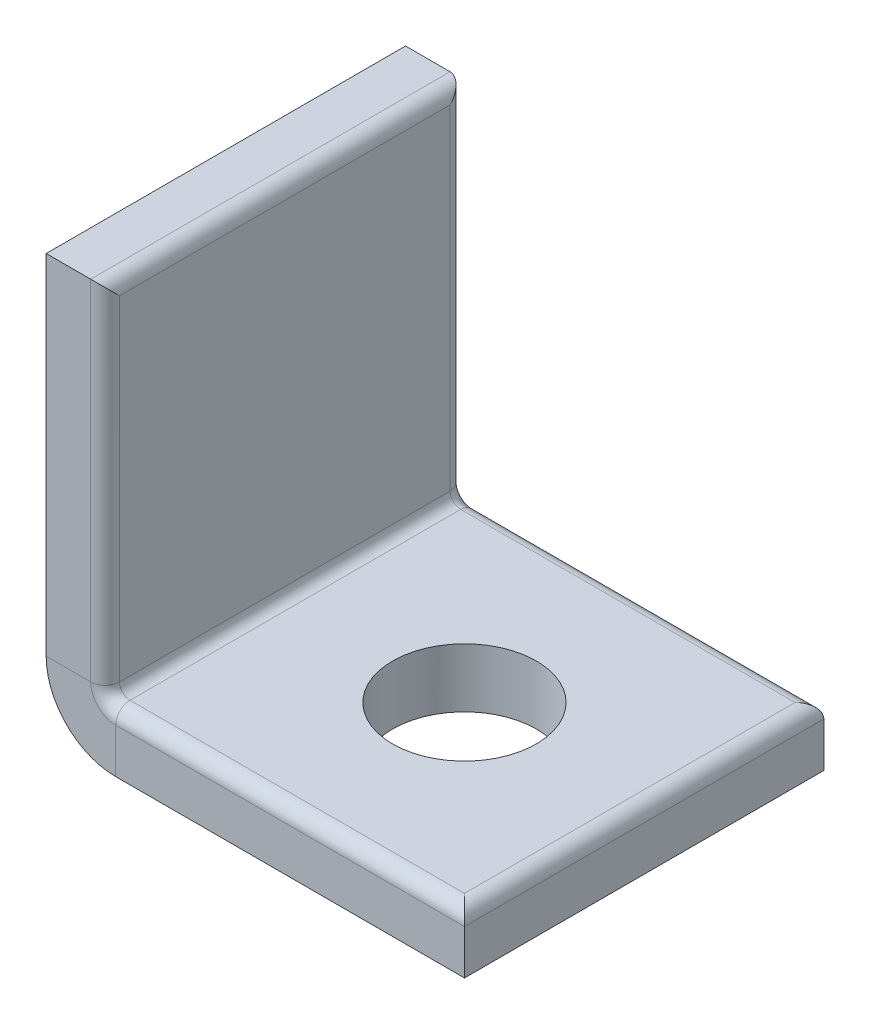
ISO-10303-21;
HEADER;
FILE_DESCRIPTION(('STEP AP214'),'2;1');
FILE_NAME('part.step','',(''),(''),'','','');
FILE_SCHEMA(('AUTOMOTIVE_DESIGN { 1 0 10303 214 1 1 1 1 }'));
ENDSEC;
DATA;
#1=APPLICATION_CONTEXT('core data for automotive mechanical design processes');
#2=APPLICATION_PROTOCOL_DEFINITION('international standard','automotive_design',2000,#1);
#3=PRODUCT_CONTEXT('',#1,'mechanical');
#4=PRODUCT('Part','Part','',(#3));
#5=PRODUCT_RELATED_PRODUCT_CATEGORY('part','',(#4));
#6=PRODUCT_DEFINITION_FORMATION('','',#4);
#7=PRODUCT_DEFINITION_CONTEXT('part definition',#1,'design');
#8=PRODUCT_DEFINITION('design','',#6,#7);
#9=PRODUCT_DEFINITION_SHAPE('','',#8);
#10=(LENGTH_UNIT() NAMED_UNIT(*) SI_UNIT(.MILLI.,.METRE.));
#11=(NAMED_UNIT(*) PLANE_ANGLE_UNIT() SI_UNIT($,.RADIAN.));
#12=(NAMED_UNIT(*) SI_UNIT($,.STERADIAN.) SOLID_ANGLE_UNIT());
#13=UNCERTAINTY_MEASURE_WITH_UNIT(LENGTH_MEASURE(1.E-05),#10,'distance_accuracy_value','');
#14=(GEOMETRIC_REPRESENTATION_CONTEXT(3) GLOBAL_UNCERTAINTY_ASSIGNED_CONTEXT((#13)) GLOBAL_UNIT_ASSIGNED_CONTEXT((#10,
#11,#12)) REPRESENTATION_CONTEXT('',''));
#15=CARTESIAN_POINT('',(0.,0.,0.));
#16=DIRECTION('',(0.,0.,1.));
#17=DIRECTION('',(1.,0.,0.));
#18=AXIS2_PLACEMENT_3D('',#15,#16,#17);
#19=CARTESIAN_POINT('',(0.,0.7366,-25.));
#20=DIRECTION('',(0.,0.,-1.));
#21=DIRECTION('',(-1.,0.,0.));
#22=AXIS2_PLACEMENT_3D('',#19,#20,#21);
#23=PLANE('',#22);
#24=DIRECTION('',(-1.,0.,0.));
#25=VECTOR('',#24,1.);
#26=CARTESIAN_POINT('',(0.,0.7366,-25.));
#27=LINE('',#26,#25);
#28=CARTESIAN_POINT('',(-1.,0.7366,-25.));
#29=VERTEX_POINT('',#28);
#30=CARTESIAN_POINT('',(-4.1,0.736600000000001,-25.));
#31=VERTEX_POINT('',#30);
#32=EDGE_CURVE('E200',#29,#31,#27,.T.);
#33=ORIENTED_EDGE('',*,*,#32,.F.);
#34=CARTESIAN_POINT('',(0.7366,0.7366,-25.));
#35=DIRECTION('',(0.,0.,-1.));
#36=DIRECTION('',(-1.,0.,0.));
#37=AXIS2_PLACEMENT_3D('',#34,#35,#36);
#38=CIRCLE('',#37,1.7366);
#39=CARTESIAN_POINT('',(0.7366,-1.,-25.));
#40=VERTEX_POINT('',#39);
#41=EDGE_CURVE('E202',#29,#40,#38,.F.);
#42=ORIENTED_EDGE('',*,*,#41,.T.);
#43=DIRECTION('',(0.,1.,0.));
#44=VECTOR('',#43,1.);
#45=CARTESIAN_POINT('',(0.7366,-4.1,-25.));
#46=LINE('',#45,#44);
#47=CARTESIAN_POINT('',(0.7366,-4.1,-25.));
#48=VERTEX_POINT('',#47);
#49=EDGE_CURVE('E198',#48,#40,#46,.T.);
#50=ORIENTED_EDGE('',*,*,#49,.F.);
#51=CARTESIAN_POINT('',(0.7366,0.7366,-25.));
#52=DIRECTION('',(0.,0.,1.));
#53=DIRECTION('',(1.,0.,0.));
#54=AXIS2_PLACEMENT_3D('',#51,#52,#53);
#55=CIRCLE('',#54,4.8366);
#56=EDGE_CURVE('E155',#31,#48,#55,.T.);
#57=ORIENTED_EDGE('',*,*,#56,.F.);
#58=EDGE_LOOP('',(#33,#42,#50,#57));
#59=FACE_BOUND('',#58,.T.);
#60=ADVANCED_FACE('F45',(#59),#23,.T.);
#61=CARTESIAN_POINT('',(0.7366,-4.1,-25.));
#62=DIRECTION('',(0.,0.,-1.));
#63=DIRECTION('',(-1.,0.,0.));
#64=AXIS2_PLACEMENT_3D('',#61,#62,#63);
#65=PLANE('',#64);
#66=DIRECTION('',(1.,0.,0.));
#67=VECTOR('',#66,1.);
#68=CARTESIAN_POINT('',(-4.1,25.,-25.));
#69=LINE('',#68,#67);
#70=CARTESIAN_POINT('',(-4.1,25.,-25.));
#71=VERTEX_POINT('',#70);
#72=CARTESIAN_POINT('',(-1.,25.,-25.));
#73=VERTEX_POINT('',#72);
#74=EDGE_CURVE('E145',#71,#73,#69,.T.);
#75=ORIENTED_EDGE('',*,*,#74,.T.);
#76=DIRECTION('',(0.,-1.,0.));
#77=VECTOR('',#76,1.);
#78=CARTESIAN_POINT('',(-1.,0.7366,-25.));
#79=LINE('',#78,#77);
#80=EDGE_CURVE('E212',#73,#29,#79,.T.);
#81=ORIENTED_EDGE('',*,*,#80,.T.);
#82=ORIENTED_EDGE('',*,*,#32,.T.);
#83=DIRECTION('',(0.,1.,0.));
#84=VECTOR('',#83,1.);
#85=CARTESIAN_POINT('',(-4.1,0.,-25.));
#86=LINE('',#85,#84);
#87=EDGE_CURVE('E172',#71,#31,#86,.F.);
#88=ORIENTED_EDGE('',*,*,#87,.F.);
#89=EDGE_LOOP('',(#75,#81,#82,#88));
#90=FACE_BOUND('',#89,.T.);
#91=ADVANCED_FACE('F292',(#90),#65,.T.);
#92=CARTESIAN_POINT('',(0.7366,0.,0.));
#93=DIRECTION('',(0.,0.,1.));
#94=DIRECTION('',(1.,0.,0.));
#95=AXIS2_PLACEMENT_3D('',#92,#93,#94);
#96=PLANE('',#95);
#97=DIRECTION('',(0.,-1.,0.));
#98=VECTOR('',#97,1.);
#99=CARTESIAN_POINT('',(0.7366,0.,0.));
#100=LINE('',#99,#98);
#101=CARTESIAN_POINT('',(0.7366,-1.,0.));
#102=VERTEX_POINT('',#101);
#103=CARTESIAN_POINT('',(0.7366,-4.1,0.));
#104=VERTEX_POINT('',#103);
#105=EDGE_CURVE('E196',#102,#104,#100,.T.);
#106=ORIENTED_EDGE('',*,*,#105,.F.);
#107=CARTESIAN_POINT('',(0.7366,0.7366,0.));
#108=DIRECTION('',(0.,0.,1.));
#109=DIRECTION('',(1.,0.,0.));
#110=AXIS2_PLACEMENT_3D('',#107,#108,#109);
#111=CIRCLE('',#110,1.7366);
#112=CARTESIAN_POINT('',(-1.,0.7366,0.));
#113=VERTEX_POINT('',#112);
#114=EDGE_CURVE('E210',#102,#113,#111,.F.);
#115=ORIENTED_EDGE('',*,*,#114,.T.);
#116=DIRECTION('',(1.,0.,0.));
#117=VECTOR('',#116,1.);
#118=CARTESIAN_POINT('',(-4.1,0.736600000000001,0.));
#119=LINE('',#118,#117);
#120=CARTESIAN_POINT('',(-4.1,0.736600000000001,0.));
#121=VERTEX_POINT('',#120);
#122=EDGE_CURVE('E184',#121,#113,#119,.T.);
#123=ORIENTED_EDGE('',*,*,#122,.F.);
#124=CARTESIAN_POINT('',(0.7366,0.7366,0.));
#125=DIRECTION('',(0.,0.,1.));
#126=DIRECTION('',(1.,0.,0.));
#127=AXIS2_PLACEMENT_3D('',#124,#125,#126);
#128=CIRCLE('',#127,4.8366);
#129=EDGE_CURVE('E161',#121,#104,#128,.T.);
#130=ORIENTED_EDGE('',*,*,#129,.T.);
#131=EDGE_LOOP('',(#106,#115,#123,#130));
#132=FACE_BOUND('',#131,.T.);
#133=ADVANCED_FACE('F309',(#132),#96,.T.);
#134=CARTESIAN_POINT('',(-4.1,0.736600000000001,0.));
#135=DIRECTION('',(0.,0.,1.));
#136=DIRECTION('',(1.,0.,0.));
#137=AXIS2_PLACEMENT_3D('',#134,#135,#136);
#138=PLANE('',#137);
#139=DIRECTION('',(0.,-1.,0.));
#140=VECTOR('',#139,1.);
#141=CARTESIAN_POINT('',(25.,0.,0.));
#142=LINE('',#141,#140);
#143=CARTESIAN_POINT('',(25.,-1.,0.));
#144=VERTEX_POINT('',#143);
#145=CARTESIAN_POINT('',(25.,-4.1,0.));
#146=VERTEX_POINT('',#145);
#147=EDGE_CURVE('E150',#144,#146,#142,.T.);
#148=ORIENTED_EDGE('',*,*,#147,.F.);
#149=DIRECTION('',(1.,0.,0.));
#150=VECTOR('',#149,1.);
#151=CARTESIAN_POINT('',(0.7366,-1.,0.));
#152=LINE('',#151,#150);
#153=EDGE_CURVE('E228',#144,#102,#152,.F.);
#154=ORIENTED_EDGE('',*,*,#153,.T.);
#155=ORIENTED_EDGE('',*,*,#105,.T.);
#156=DIRECTION('',(1.,0.,0.));
#157=VECTOR('',#156,1.);
#158=CARTESIAN_POINT('',(0.,-4.1,0.));
#159=LINE('',#158,#157);
#160=EDGE_CURVE('E176',#104,#146,#159,.T.);
#161=ORIENTED_EDGE('',*,*,#160,.T.);
#162=EDGE_LOOP('',(#148,#154,#155,#161));
#163=FACE_BOUND('',#162,.T.);
#164=ADVANCED_FACE('F311',(#163),#138,.T.);
#165=CARTESIAN_POINT('',(0.,-4.1,-25.));
#166=DIRECTION('',(0.,-1.,0.));
#167=DIRECTION('',(0.,0.,-1.));
#168=AXIS2_PLACEMENT_3D('',#165,#166,#167);
#169=PLANE('',#168);
#170=CARTESIAN_POINT('',(12.5,-4.1,-12.5));
#171=DIRECTION('',(0.,-1.,0.));
#172=DIRECTION('',(0.,0.,-1.));
#173=AXIS2_PLACEMENT_3D('',#170,#171,#172);
#174=CIRCLE('',#173,5.);
#175=CARTESIAN_POINT('',(12.5,-4.1,-17.5));
#176=VERTEX_POINT('',#175);
#177=EDGE_CURVE('E167',#176,#176,#174,.T.);
#178=ORIENTED_EDGE('',*,*,#177,.F.);
#179=EDGE_LOOP('',(#178));
#180=FACE_BOUND('',#179,.T.);
#181=ORIENTED_EDGE('',*,*,#160,.F.);
#182=DIRECTION('',(0.,0.,1.));
#183=VECTOR('',#182,1.);
#184=CARTESIAN_POINT('',(0.7366,-4.1,-25.));
#185=LINE('',#184,#183);
#186=EDGE_CURVE('E160',#48,#104,#185,.T.);
#187=ORIENTED_EDGE('',*,*,#186,.F.);
#188=DIRECTION('',(1.,0.,0.));
#189=VECTOR('',#188,1.);
#190=CARTESIAN_POINT('',(0.,-4.1,-25.));
#191=LINE('',#190,#189);
#192=CARTESIAN_POINT('',(25.,-4.1,-25.));
#193=VERTEX_POINT('',#192);
#194=EDGE_CURVE('E141',#48,#193,#191,.T.);
#195=ORIENTED_EDGE('',*,*,#194,.T.);
#196=DIRECTION('',(0.,0.,1.));
#197=VECTOR('',#196,1.);
#198=CARTESIAN_POINT('',(25.,-4.1,-25.));
#199=LINE('',#198,#197);
#200=EDGE_CURVE('E148',#193,#146,#199,.T.);
#201=ORIENTED_EDGE('',*,*,#200,.T.);
#202=EDGE_LOOP('',(#181,#187,#195,#201));
#203=FACE_BOUND('',#202,.T.);
#204=ADVANCED_FACE('F158',(#180,#203),#169,.T.);
#205=CARTESIAN_POINT('',(0.7366,0.7366,-25.));
#206=DIRECTION('',(0.,0.,1.));
#207=DIRECTION('',(1.,0.,0.));
#208=AXIS2_PLACEMENT_3D('',#205,#206,#207);
#209=CYLINDRICAL_SURFACE('',#208,4.8366);
#210=ORIENTED_EDGE('',*,*,#129,.F.);
#211=DIRECTION('',(0.,0.,1.));
#212=VECTOR('',#211,1.);
#213=CARTESIAN_POINT('',(-4.1,0.736600000000001,-25.));
#214=LINE('',#213,#212);
#215=EDGE_CURVE('E185',#31,#121,#214,.T.);
#216=ORIENTED_EDGE('',*,*,#215,.F.);
#217=ORIENTED_EDGE('',*,*,#56,.T.);
#218=ORIENTED_EDGE('',*,*,#186,.T.);
#219=EDGE_LOOP('',(#210,#216,#217,#218));
#220=FACE_BOUND('',#219,.T.);
#221=ADVANCED_FACE('F300',(#220),#209,.T.);
#222=CARTESIAN_POINT('',(-4.1,0.,-25.));
#223=DIRECTION('',(-1.,0.,0.));
#224=DIRECTION('',(0.,0.,1.));
#225=AXIS2_PLACEMENT_3D('',#222,#223,#224);
#226=PLANE('',#225);
#227=DIRECTION('',(0.,1.,0.));
#228=VECTOR('',#227,1.);
#229=CARTESIAN_POINT('',(-4.1,0.,0.));
#230=LINE('',#229,#228);
#231=CARTESIAN_POINT('',(-4.1,25.,0.));
#232=VERTEX_POINT('',#231);
#233=EDGE_CURVE('E164',#232,#121,#230,.F.);
#234=ORIENTED_EDGE('',*,*,#233,.F.);
#235=DIRECTION('',(0.,0.,1.));
#236=VECTOR('',#235,1.);
#237=CARTESIAN_POINT('',(-4.1,25.,-25.));
#238=LINE('',#237,#236);
#239=EDGE_CURVE('E188',#71,#232,#238,.T.);
#240=ORIENTED_EDGE('',*,*,#239,.F.);
#241=ORIENTED_EDGE('',*,*,#87,.T.);
#242=ORIENTED_EDGE('',*,*,#215,.T.);
#243=EDGE_LOOP('',(#234,#240,#241,#242));
#244=FACE_BOUND('',#243,.T.);
#245=ADVANCED_FACE('F303',(#244),#226,.T.);
#246=CARTESIAN_POINT('',(-4.1,25.,-25.));
#247=DIRECTION('',(0.,-1.,0.));
#248=DIRECTION('',(0.,0.,-1.));
#249=AXIS2_PLACEMENT_3D('',#246,#247,#248);
#250=PLANE('',#249);
#251=DIRECTION('',(1.,0.,0.));
#252=VECTOR('',#251,1.);
#253=CARTESIAN_POINT('',(-4.1,25.,0.));
#254=LINE('',#253,#252);
#255=CARTESIAN_POINT('',(-1.,25.,0.));
#256=VERTEX_POINT('',#255);
#257=EDGE_CURVE('E179',#232,#256,#254,.T.);
#258=ORIENTED_EDGE('',*,*,#257,.T.);
#259=DIRECTION('',(0.,0.,1.));
#260=VECTOR('',#259,1.);
#261=CARTESIAN_POINT('',(-1.,25.,-25.));
#262=LINE('',#261,#260);
#263=EDGE_CURVE('E54',#256,#73,#262,.F.);
#264=ORIENTED_EDGE('',*,*,#263,.T.);
#265=ORIENTED_EDGE('',*,*,#74,.F.);
#266=ORIENTED_EDGE('',*,*,#239,.T.);
#267=EDGE_LOOP('',(#258,#264,#265,#266));
#268=FACE_BOUND('',#267,.T.);
#269=ADVANCED_FACE('F305',(#268),#250,.F.);
#270=CARTESIAN_POINT('',(0.,0.,-25.));
#271=DIRECTION('',(-1.,0.,0.));
#272=DIRECTION('',(0.,0.,1.));
#273=AXIS2_PLACEMENT_3D('',#270,#271,#272);
#274=PLANE('',#273);
#275=DIRECTION('',(0.,0.,1.));
#276=VECTOR('',#275,1.);
#277=CARTESIAN_POINT('',(0.,0.7366,-25.));
#278=LINE('',#277,#276);
#279=CARTESIAN_POINT('',(0.,0.7366,-24.));
#280=VERTEX_POINT('',#279);
#281=CARTESIAN_POINT('',(0.,0.7366,-1.));
#282=VERTEX_POINT('',#281);
#283=EDGE_CURVE('E190',#280,#282,#278,.T.);
#284=ORIENTED_EDGE('',*,*,#283,.F.);
#285=DIRECTION('',(0.,-1.,0.));
#286=VECTOR('',#285,1.);
#287=CARTESIAN_POINT('',(0.,25.,-24.));
#288=LINE('',#287,#286);
#289=CARTESIAN_POINT('',(0.,24.,-24.));
#290=VERTEX_POINT('',#289);
#291=EDGE_CURVE('E218',#280,#290,#288,.F.);
#292=ORIENTED_EDGE('',*,*,#291,.T.);
#293=DIRECTION('',(0.,0.,1.));
#294=VECTOR('',#293,1.);
#295=CARTESIAN_POINT('',(0.,24.,-25.));
#296=LINE('',#295,#294);
#297=CARTESIAN_POINT('',(0.,24.,-1.));
#298=VERTEX_POINT('',#297);
#299=EDGE_CURVE('E214',#290,#298,#296,.T.);
#300=ORIENTED_EDGE('',*,*,#299,.T.);
#301=DIRECTION('',(0.,-1.,0.));
#302=VECTOR('',#301,1.);
#303=CARTESIAN_POINT('',(0.,0.,-1.));
#304=LINE('',#303,#302);
#305=EDGE_CURVE('E216',#298,#282,#304,.T.);
#306=ORIENTED_EDGE('',*,*,#305,.T.);
#307=EDGE_LOOP('',(#284,#292,#300,#306));
#308=FACE_BOUND('',#307,.T.);
#309=ADVANCED_FACE('F281',(#308),#274,.F.);
#310=CARTESIAN_POINT('',(0.7366,0.7366,-25.));
#311=DIRECTION('',(0.,0.,1.));
#312=DIRECTION('',(1.,0.,0.));
#313=AXIS2_PLACEMENT_3D('',#310,#311,#312);
#314=CYLINDRICAL_SURFACE('',#313,0.7366);
#315=DIRECTION('',(0.,0.,1.));
#316=VECTOR('',#315,1.);
#317=CARTESIAN_POINT('',(0.7366,0.,-25.));
#318=LINE('',#317,#316);
#319=CARTESIAN_POINT('',(0.7366,0.,-24.));
#320=VERTEX_POINT('',#319);
#321=CARTESIAN_POINT('',(0.7366,0.,-1.));
#322=VERTEX_POINT('',#321);
#323=EDGE_CURVE('E154',#320,#322,#318,.T.);
#324=ORIENTED_EDGE('',*,*,#323,.F.);
#325=CARTESIAN_POINT('',(0.7366,0.7366,-24.));
#326=DIRECTION('',(0.,0.,-1.));
#327=DIRECTION('',(-1.,0.,0.));
#328=AXIS2_PLACEMENT_3D('',#325,#326,#327);
#329=CIRCLE('',#328,0.7366);
#330=EDGE_CURVE('E207',#320,#280,#329,.T.);
#331=ORIENTED_EDGE('',*,*,#330,.T.);
#332=ORIENTED_EDGE('',*,*,#283,.T.);
#333=CARTESIAN_POINT('',(0.7366,0.7366,-1.));
#334=DIRECTION('',(0.,0.,1.));
#335=DIRECTION('',(1.,0.,0.));
#336=AXIS2_PLACEMENT_3D('',#333,#334,#335);
#337=CIRCLE('',#336,0.7366);
#338=EDGE_CURVE('E205',#282,#322,#337,.T.);
#339=ORIENTED_EDGE('',*,*,#338,.T.);
#340=EDGE_LOOP('',(#324,#331,#332,#339));
#341=FACE_BOUND('',#340,.T.);
#342=ADVANCED_FACE('F263',(#341),#314,.F.);
#343=CARTESIAN_POINT('',(0.,0.,-25.));
#344=DIRECTION('',(0.,-1.,0.));
#345=DIRECTION('',(0.,0.,-1.));
#346=AXIS2_PLACEMENT_3D('',#343,#344,#345);
#347=PLANE('',#346);
#348=CARTESIAN_POINT('',(12.5,0.,-12.5));
#349=DIRECTION('',(0.,1.,0.));
#350=DIRECTION('',(0.,0.,1.));
#351=AXIS2_PLACEMENT_3D('',#348,#349,#350);
#352=CIRCLE('',#351,5.);
#353=CARTESIAN_POINT('',(12.5,0.,-7.5));
#354=VERTEX_POINT('',#353);
#355=EDGE_CURVE('E536',#354,#354,#352,.T.);
#356=ORIENTED_EDGE('',*,*,#355,.F.);
#357=EDGE_LOOP('',(#356));
#358=FACE_BOUND('',#357,.T.);
#359=DIRECTION('',(0.,0.,1.));
#360=VECTOR('',#359,1.);
#361=CARTESIAN_POINT('',(24.,0.,-25.));
#362=LINE('',#361,#360);
#363=CARTESIAN_POINT('',(24.,0.,-1.));
#364=VERTEX_POINT('',#363);
#365=CARTESIAN_POINT('',(24.,0.,-24.));
#366=VERTEX_POINT('',#365);
#367=EDGE_CURVE('E221',#364,#366,#362,.F.);
#368=ORIENTED_EDGE('',*,*,#367,.T.);
#369=DIRECTION('',(1.,0.,0.));
#370=VECTOR('',#369,1.);
#371=CARTESIAN_POINT('',(0.7366,0.,-24.));
#372=LINE('',#371,#370);
#373=EDGE_CURVE('E225',#366,#320,#372,.F.);
#374=ORIENTED_EDGE('',*,*,#373,.T.);
#375=ORIENTED_EDGE('',*,*,#323,.T.);
#376=DIRECTION('',(1.,0.,0.));
#377=VECTOR('',#376,1.);
#378=CARTESIAN_POINT('',(25.,0.,-1.));
#379=LINE('',#378,#377);
#380=EDGE_CURVE('E223',#322,#364,#379,.T.);
#381=ORIENTED_EDGE('',*,*,#380,.T.);
#382=EDGE_LOOP('',(#368,#374,#375,#381));
#383=FACE_BOUND('',#382,.T.);
#384=ADVANCED_FACE('F267',(#358,#383),#347,.F.);
#385=CARTESIAN_POINT('',(25.,0.,-25.));
#386=DIRECTION('',(-1.,0.,0.));
#387=DIRECTION('',(0.,0.,1.));
#388=AXIS2_PLACEMENT_3D('',#385,#386,#387);
#389=PLANE('',#388);
#390=DIRECTION('',(0.,-1.,0.));
#391=VECTOR('',#390,1.);
#392=CARTESIAN_POINT('',(25.,0.,-25.));
#393=LINE('',#392,#391);
#394=CARTESIAN_POINT('',(25.,-1.,-25.));
#395=VERTEX_POINT('',#394);
#396=EDGE_CURVE('E136',#395,#193,#393,.T.);
#397=ORIENTED_EDGE('',*,*,#396,.F.);
#398=DIRECTION('',(0.,0.,1.));
#399=VECTOR('',#398,1.);
#400=CARTESIAN_POINT('',(25.,-1.,-25.));
#401=LINE('',#400,#399);
#402=EDGE_CURVE('E11',#395,#144,#401,.T.);
#403=ORIENTED_EDGE('',*,*,#402,.T.);
#404=ORIENTED_EDGE('',*,*,#147,.T.);
#405=ORIENTED_EDGE('',*,*,#200,.F.);
#406=EDGE_LOOP('',(#397,#403,#404,#405));
#407=FACE_BOUND('',#406,.T.);
#408=ADVANCED_FACE('F149',(#407),#389,.F.);
#409=CARTESIAN_POINT('',(0.7366,0.7366,-25.));
#410=DIRECTION('',(0.,0.,-1.));
#411=DIRECTION('',(-1.,0.,0.));
#412=AXIS2_PLACEMENT_3D('',#409,#410,#411);
#413=PLANE('',#412);
#414=ORIENTED_EDGE('',*,*,#49,.T.);
#415=DIRECTION('',(1.,0.,0.));
#416=VECTOR('',#415,1.);
#417=CARTESIAN_POINT('',(25.,-1.,-25.));
#418=LINE('',#417,#416);
#419=EDGE_CURVE('E144',#40,#395,#418,.T.);
#420=ORIENTED_EDGE('',*,*,#419,.T.);
#421=ORIENTED_EDGE('',*,*,#396,.T.);
#422=ORIENTED_EDGE('',*,*,#194,.F.);
#423=EDGE_LOOP('',(#414,#420,#421,#422));
#424=FACE_BOUND('',#423,.T.);
#425=ADVANCED_FACE('F139',(#424),#413,.T.);
#426=CARTESIAN_POINT('',(0.7366,0.7366,0.));
#427=DIRECTION('',(0.,0.,-1.));
#428=DIRECTION('',(-1.,0.,0.));
#429=AXIS2_PLACEMENT_3D('',#426,#427,#428);
#430=PLANE('',#429);
#431=ORIENTED_EDGE('',*,*,#122,.T.);
#432=DIRECTION('',(0.,-1.,0.));
#433=VECTOR('',#432,1.);
#434=CARTESIAN_POINT('',(-1.,0.7366,0.));
#435=LINE('',#434,#433);
#436=EDGE_CURVE('E68',#113,#256,#435,.F.);
#437=ORIENTED_EDGE('',*,*,#436,.T.);
#438=ORIENTED_EDGE('',*,*,#257,.F.);
#439=ORIENTED_EDGE('',*,*,#233,.T.);
#440=EDGE_LOOP('',(#431,#437,#438,#439));
#441=FACE_BOUND('',#440,.T.);
#442=ADVANCED_FACE('F306',(#441),#430,.F.);
#443=CARTESIAN_POINT('',(0.7366,0.7366,-1.));
#444=DIRECTION('',(0.,0.,1.));
#445=DIRECTION('',(1.,0.,0.));
#446=AXIS2_PLACEMENT_3D('',#443,#444,#445);
#447=TOROIDAL_SURFACE('',#446,1.7366,1.);
#448=CARTESIAN_POINT('',(0.7366,-1.,-1.));
#449=DIRECTION('',(1.,0.,0.));
#450=DIRECTION('',(0.,0.,-1.));
#451=AXIS2_PLACEMENT_3D('',#448,#449,#450);
#452=CIRCLE('',#451,1.);
#453=EDGE_CURVE('E246',#322,#102,#452,.T.);
#454=ORIENTED_EDGE('',*,*,#453,.F.);
#455=ORIENTED_EDGE('',*,*,#338,.F.);
#456=CARTESIAN_POINT('',(-1.,0.7366,-1.));
#457=DIRECTION('',(0.,1.,0.));
#458=DIRECTION('',(-1.,0.,0.));
#459=AXIS2_PLACEMENT_3D('',#456,#457,#458);
#460=CIRCLE('',#459,1.);
#461=EDGE_CURVE('E49',#113,#282,#460,.T.);
#462=ORIENTED_EDGE('',*,*,#461,.F.);
#463=ORIENTED_EDGE('',*,*,#114,.F.);
#464=EDGE_LOOP('',(#454,#455,#462,#463));
#465=FACE_BOUND('',#464,.T.);
#466=ADVANCED_FACE('F47',(#465),#447,.T.);
#467=CARTESIAN_POINT('',(-1.,0.,-1.));
#468=DIRECTION('',(0.,-1.,0.));
#469=DIRECTION('',(0.,0.,-1.));
#470=AXIS2_PLACEMENT_3D('',#467,#468,#469);
#471=CYLINDRICAL_SURFACE('',#470,1.);
#472=ORIENTED_EDGE('',*,*,#461,.T.);
#473=ORIENTED_EDGE('',*,*,#305,.F.);
#474=CARTESIAN_POINT('',(-1.,24.,-1.));
#475=DIRECTION('',(0.,-0.707106781186547,0.707106781186547));
#476=DIRECTION('',(0.,0.707106781186547,0.707106781186547));
#477=AXIS2_PLACEMENT_3D('',#474,#475,#476);
#478=ELLIPSE('',#477,1.41421356237309,1.);
#479=EDGE_CURVE('E244',#256,#298,#478,.F.);
#480=ORIENTED_EDGE('',*,*,#479,.F.);
#481=ORIENTED_EDGE('',*,*,#436,.F.);
#482=EDGE_LOOP('',(#472,#473,#480,#481));
#483=FACE_BOUND('',#482,.T.);
#484=ADVANCED_FACE('F256',(#483),#471,.T.);
#485=CARTESIAN_POINT('',(0.,-1.,-1.));
#486=DIRECTION('',(-1.,0.,0.));
#487=DIRECTION('',(0.,0.,1.));
#488=AXIS2_PLACEMENT_3D('',#485,#486,#487);
#489=CYLINDRICAL_SURFACE('',#488,1.);
#490=ORIENTED_EDGE('',*,*,#453,.T.);
#491=ORIENTED_EDGE('',*,*,#153,.F.);
#492=CARTESIAN_POINT('',(24.,-1.,-1.));
#493=DIRECTION('',(-0.707106781186547,0.,0.707106781186547));
#494=DIRECTION('',(0.707106781186547,0.,0.707106781186547));
#495=AXIS2_PLACEMENT_3D('',#492,#493,#494);
#496=ELLIPSE('',#495,1.41421356237309,1.);
#497=EDGE_CURVE('E241',#364,#144,#496,.F.);
#498=ORIENTED_EDGE('',*,*,#497,.F.);
#499=ORIENTED_EDGE('',*,*,#380,.F.);
#500=EDGE_LOOP('',(#490,#491,#498,#499));
#501=FACE_BOUND('',#500,.T.);
#502=ADVANCED_FACE('F312',(#501),#489,.T.);
#503=CARTESIAN_POINT('',(-1.,24.,-25.));
#504=DIRECTION('',(0.,0.,1.));
#505=DIRECTION('',(1.,0.,0.));
#506=AXIS2_PLACEMENT_3D('',#503,#504,#505);
#507=CYLINDRICAL_SURFACE('',#506,1.);
#508=ORIENTED_EDGE('',*,*,#479,.T.);
#509=ORIENTED_EDGE('',*,*,#299,.F.);
#510=CARTESIAN_POINT('',(-1.,24.,-24.));
#511=DIRECTION('',(0.,0.707106781186547,0.707106781186547));
#512=DIRECTION('',(0.,-0.707106781186547,0.707106781186547));
#513=AXIS2_PLACEMENT_3D('',#510,#511,#512);
#514=ELLIPSE('',#513,1.41421356237309,1.);
#515=EDGE_CURVE('E238',#73,#290,#514,.F.);
#516=ORIENTED_EDGE('',*,*,#515,.F.);
#517=ORIENTED_EDGE('',*,*,#263,.F.);
#518=EDGE_LOOP('',(#508,#509,#516,#517));
#519=FACE_BOUND('',#518,.T.);
#520=ADVANCED_FACE('F285',(#519),#507,.T.);
#521=CARTESIAN_POINT('',(24.,-1.,-25.));
#522=DIRECTION('',(0.,0.,1.));
#523=DIRECTION('',(1.,0.,0.));
#524=AXIS2_PLACEMENT_3D('',#521,#522,#523);
#525=CYLINDRICAL_SURFACE('',#524,1.);
#526=ORIENTED_EDGE('',*,*,#497,.T.);
#527=ORIENTED_EDGE('',*,*,#402,.F.);
#528=CARTESIAN_POINT('',(24.,-1.,-24.));
#529=DIRECTION('',(0.707106781186547,0.,0.707106781186547));
#530=DIRECTION('',(-0.707106781186547,0.,0.707106781186547));
#531=AXIS2_PLACEMENT_3D('',#528,#529,#530);
#532=ELLIPSE('',#531,1.41421356237309,1.);
#533=EDGE_CURVE('E235',#366,#395,#532,.F.);
#534=ORIENTED_EDGE('',*,*,#533,.F.);
#535=ORIENTED_EDGE('',*,*,#367,.F.);
#536=EDGE_LOOP('',(#526,#527,#534,#535));
#537=FACE_BOUND('',#536,.T.);
#538=ADVANCED_FACE('F314',(#537),#525,.T.);
#539=CARTESIAN_POINT('',(-1.,-4.1,-24.));
#540=DIRECTION('',(0.,1.,0.));
#541=DIRECTION('',(0.,0.,1.));
#542=AXIS2_PLACEMENT_3D('',#539,#540,#541);
#543=CYLINDRICAL_SURFACE('',#542,1.);
#544=ORIENTED_EDGE('',*,*,#515,.T.);
#545=ORIENTED_EDGE('',*,*,#291,.F.);
#546=CARTESIAN_POINT('',(-1.,0.7366,-24.));
#547=DIRECTION('',(0.,-1.,0.));
#548=DIRECTION('',(1.,0.,0.));
#549=AXIS2_PLACEMENT_3D('',#546,#547,#548);
#550=CIRCLE('',#549,1.);
#551=EDGE_CURVE('E233',#29,#280,#550,.T.);
#552=ORIENTED_EDGE('',*,*,#551,.F.);
#553=ORIENTED_EDGE('',*,*,#80,.F.);
#554=EDGE_LOOP('',(#544,#545,#552,#553));
#555=FACE_BOUND('',#554,.T.);
#556=ADVANCED_FACE('F289',(#555),#543,.T.);
#557=CARTESIAN_POINT('',(0.7366,-1.,-24.));
#558=DIRECTION('',(-1.,0.,0.));
#559=DIRECTION('',(0.,0.,1.));
#560=AXIS2_PLACEMENT_3D('',#557,#558,#559);
#561=CYLINDRICAL_SURFACE('',#560,1.);
#562=ORIENTED_EDGE('',*,*,#533,.T.);
#563=ORIENTED_EDGE('',*,*,#419,.F.);
#564=CARTESIAN_POINT('',(0.7366,-1.,-24.));
#565=DIRECTION('',(-1.,0.,0.));
#566=DIRECTION('',(0.,0.,1.));
#567=AXIS2_PLACEMENT_3D('',#564,#565,#566);
#568=CIRCLE('',#567,1.);
#569=EDGE_CURVE('E231',#320,#40,#568,.T.);
#570=ORIENTED_EDGE('',*,*,#569,.F.);
#571=ORIENTED_EDGE('',*,*,#373,.F.);
#572=EDGE_LOOP('',(#562,#563,#570,#571));
#573=FACE_BOUND('',#572,.T.);
#574=ADVANCED_FACE('F274',(#573),#561,.T.);
#575=CARTESIAN_POINT('',(0.7366,0.7366,-24.));
#576=DIRECTION('',(0.,0.,-1.));
#577=DIRECTION('',(-1.,0.,0.));
#578=AXIS2_PLACEMENT_3D('',#575,#576,#577);
#579=TOROIDAL_SURFACE('',#578,1.7366,1.);
#580=ORIENTED_EDGE('',*,*,#551,.T.);
#581=ORIENTED_EDGE('',*,*,#330,.F.);
#582=ORIENTED_EDGE('',*,*,#569,.T.);
#583=ORIENTED_EDGE('',*,*,#41,.F.);
#584=EDGE_LOOP('',(#580,#581,#582,#583));
#585=FACE_BOUND('',#584,.T.);
#586=ADVANCED_FACE('F277',(#585),#579,.T.);
#587=CARTESIAN_POINT('',(12.5,-10.,-12.5));
#588=DIRECTION('',(0.,1.,0.));
#589=DIRECTION('',(0.,0.,1.));
#590=AXIS2_PLACEMENT_3D('',#587,#588,#589);
#591=CYLINDRICAL_SURFACE('',#590,5.);
#592=ORIENTED_EDGE('',*,*,#177,.T.);
#593=EDGE_LOOP('',(#592));
#594=FACE_BOUND('',#593,.T.);
#595=ORIENTED_EDGE('',*,*,#355,.T.);
#596=EDGE_LOOP('',(#595));
#597=FACE_BOUND('',#596,.T.);
#598=ADVANCED_FACE('F334',(#594,#597),#591,.F.);
#599=CLOSED_SHELL('',(#60,#91,#133,#164,#204,#221,#245,#269,#309,#342,#384,#408,#425,#442,#466,
#484,#502,#520,#538,#556,#574,#586,#598));
#600=MANIFOLD_SOLID_BREP('B2',#599);
#601=ADVANCED_BREP_SHAPE_REPRESENTATION('',(#18,#600),#14);
#602=SHAPE_DEFINITION_REPRESENTATION(#9,#601);
ENDSEC;
END-ISO-10303-21;
